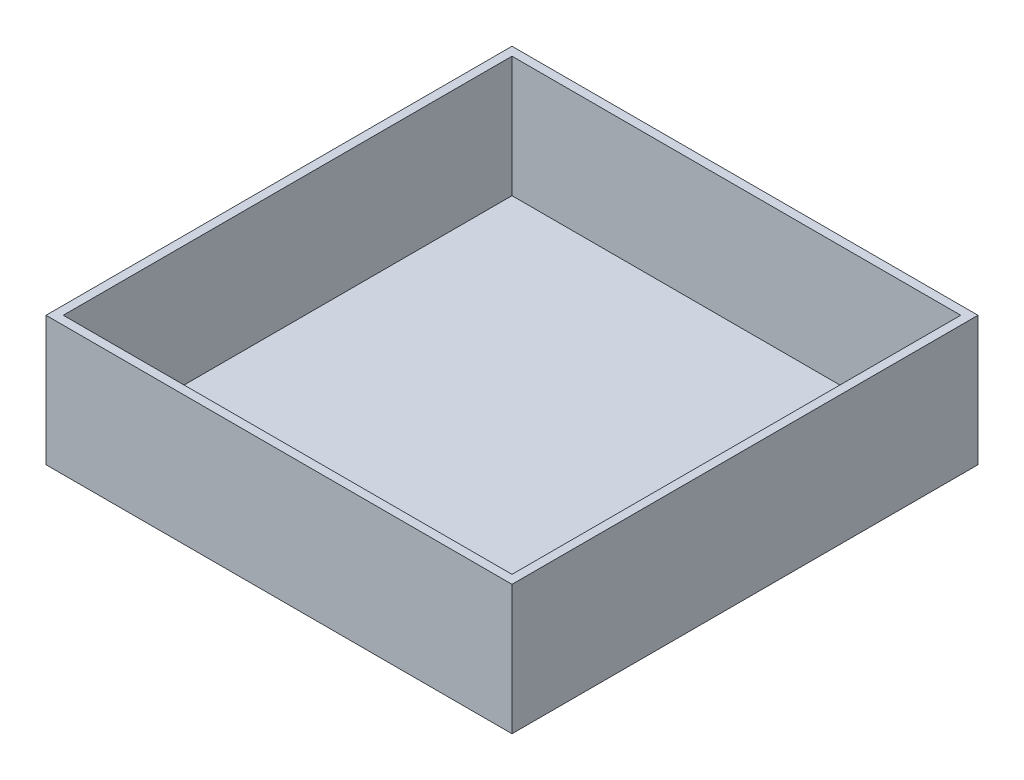
ISO-10303-21;
HEADER;
FILE_DESCRIPTION(('STEP AP214'),'2;1');
FILE_NAME('part.step','',(''),(''),'','','');
FILE_SCHEMA(('AUTOMOTIVE_DESIGN { 1 0 10303 214 1 1 1 1 }'));
ENDSEC;
DATA;
#1=APPLICATION_CONTEXT('core data for automotive mechanical design processes');
#2=APPLICATION_PROTOCOL_DEFINITION('international standard','automotive_design',2000,#1);
#3=PRODUCT_CONTEXT('',#1,'mechanical');
#4=PRODUCT('Part','Part','',(#3));
#5=PRODUCT_RELATED_PRODUCT_CATEGORY('part','',(#4));
#6=PRODUCT_DEFINITION_FORMATION('','',#4);
#7=PRODUCT_DEFINITION_CONTEXT('part definition',#1,'design');
#8=PRODUCT_DEFINITION('design','',#6,#7);
#9=PRODUCT_DEFINITION_SHAPE('','',#8);
#10=(LENGTH_UNIT() NAMED_UNIT(*) SI_UNIT(.MILLI.,.METRE.));
#11=(NAMED_UNIT(*) PLANE_ANGLE_UNIT() SI_UNIT($,.RADIAN.));
#12=(NAMED_UNIT(*) SI_UNIT($,.STERADIAN.) SOLID_ANGLE_UNIT());
#13=UNCERTAINTY_MEASURE_WITH_UNIT(LENGTH_MEASURE(1.E-05),#10,'distance_accuracy_value','');
#14=(GEOMETRIC_REPRESENTATION_CONTEXT(3) GLOBAL_UNCERTAINTY_ASSIGNED_CONTEXT((#13)) GLOBAL_UNIT_ASSIGNED_CONTEXT((#10,
#11,#12)) REPRESENTATION_CONTEXT('',''));
#15=CARTESIAN_POINT('',(0.,0.,0.));
#16=DIRECTION('',(0.,0.,1.));
#17=DIRECTION('',(1.,0.,0.));
#18=AXIS2_PLACEMENT_3D('',#15,#16,#17);
#19=CARTESIAN_POINT('',(152.4,0.,-152.4));
#20=DIRECTION('',(0.,0.,1.));
#21=DIRECTION('',(1.,0.,0.));
#22=AXIS2_PLACEMENT_3D('',#19,#20,#21);
#23=PLANE('',#22);
#24=DIRECTION('',(1.,0.,0.));
#25=VECTOR('',#24,1.);
#26=CARTESIAN_POINT('',(8077.2,0.,-152.4));
#27=LINE('',#26,#25);
#28=CARTESIAN_POINT('',(152.4,0.,-152.4));
#29=VERTEX_POINT('',#28);
#30=CARTESIAN_POINT('',(8077.2,0.,-152.4));
#31=VERTEX_POINT('',#30);
#32=EDGE_CURVE('E46',#29,#31,#27,.T.);
#33=ORIENTED_EDGE('',*,*,#32,.F.);
#34=DIRECTION('',(0.,1.,0.));
#35=VECTOR('',#34,1.);
#36=CARTESIAN_POINT('',(152.4,0.,-152.4));
#37=LINE('',#36,#35);
#38=CARTESIAN_POINT('',(152.4,2133.6,-152.4));
#39=VERTEX_POINT('',#38);
#40=EDGE_CURVE('E138',#29,#39,#37,.T.);
#41=ORIENTED_EDGE('',*,*,#40,.T.);
#42=DIRECTION('',(1.,0.,0.));
#43=VECTOR('',#42,1.);
#44=CARTESIAN_POINT('',(152.4,2133.6,-152.4));
#45=LINE('',#44,#43);
#46=CARTESIAN_POINT('',(8077.2,2133.6,-152.4));
#47=VERTEX_POINT('',#46);
#48=EDGE_CURVE('E129',#39,#47,#45,.T.);
#49=ORIENTED_EDGE('',*,*,#48,.T.);
#50=DIRECTION('',(0.,1.,0.));
#51=VECTOR('',#50,1.);
#52=CARTESIAN_POINT('',(8077.2,0.,-152.4));
#53=LINE('',#52,#51);
#54=EDGE_CURVE('E106',#31,#47,#53,.T.);
#55=ORIENTED_EDGE('',*,*,#54,.F.);
#56=EDGE_LOOP('',(#33,#41,#49,#55));
#57=FACE_BOUND('',#56,.T.);
#58=ADVANCED_FACE('F31',(#57),#23,.F.);
#59=CARTESIAN_POINT('',(152.4,0.,-8077.2));
#60=DIRECTION('',(-1.,0.,0.));
#61=DIRECTION('',(0.,0.,1.));
#62=AXIS2_PLACEMENT_3D('',#59,#60,#61);
#63=PLANE('',#62);
#64=DIRECTION('',(0.,0.,1.));
#65=VECTOR('',#64,1.);
#66=CARTESIAN_POINT('',(152.4,0.,-16003.4652491574));
#67=LINE('',#66,#65);
#68=CARTESIAN_POINT('',(152.4,0.,-8077.2));
#69=VERTEX_POINT('',#68);
#70=EDGE_CURVE('E53',#69,#29,#67,.T.);
#71=ORIENTED_EDGE('',*,*,#70,.F.);
#72=DIRECTION('',(0.,1.,0.));
#73=VECTOR('',#72,1.);
#74=CARTESIAN_POINT('',(152.4,0.,-8077.2));
#75=LINE('',#74,#73);
#76=CARTESIAN_POINT('',(152.4,2133.6,-8077.2));
#77=VERTEX_POINT('',#76);
#78=EDGE_CURVE('E105',#69,#77,#75,.T.);
#79=ORIENTED_EDGE('',*,*,#78,.T.);
#80=DIRECTION('',(0.,0.,1.));
#81=VECTOR('',#80,1.);
#82=CARTESIAN_POINT('',(152.4,2133.6,-8077.2));
#83=LINE('',#82,#81);
#84=EDGE_CURVE('E135',#77,#39,#83,.T.);
#85=ORIENTED_EDGE('',*,*,#84,.T.);
#86=ORIENTED_EDGE('',*,*,#40,.F.);
#87=EDGE_LOOP('',(#71,#79,#85,#86));
#88=FACE_BOUND('',#87,.T.);
#89=ADVANCED_FACE('F187',(#88),#63,.F.);
#90=CARTESIAN_POINT('',(8077.2,0.,-8077.2));
#91=DIRECTION('',(0.,0.,-1.));
#92=DIRECTION('',(-1.,0.,0.));
#93=AXIS2_PLACEMENT_3D('',#90,#91,#92);
#94=PLANE('',#93);
#95=DIRECTION('',(1.,0.,0.));
#96=VECTOR('',#95,1.);
#97=CARTESIAN_POINT('',(8077.2,0.,-8077.2));
#98=LINE('',#97,#96);
#99=CARTESIAN_POINT('',(8077.2,0.,-8077.2));
#100=VERTEX_POINT('',#99);
#101=EDGE_CURVE('E109',#69,#100,#98,.T.);
#102=ORIENTED_EDGE('',*,*,#101,.T.);
#103=DIRECTION('',(0.,1.,0.));
#104=VECTOR('',#103,1.);
#105=CARTESIAN_POINT('',(8077.2,0.,-8077.2));
#106=LINE('',#105,#104);
#107=CARTESIAN_POINT('',(8077.2,2133.6,-8077.2));
#108=VERTEX_POINT('',#107);
#109=EDGE_CURVE('E95',#100,#108,#106,.T.);
#110=ORIENTED_EDGE('',*,*,#109,.T.);
#111=DIRECTION('',(-1.,0.,0.));
#112=VECTOR('',#111,1.);
#113=CARTESIAN_POINT('',(8077.2,2133.6,-8077.2));
#114=LINE('',#113,#112);
#115=EDGE_CURVE('E133',#108,#77,#114,.T.);
#116=ORIENTED_EDGE('',*,*,#115,.T.);
#117=ORIENTED_EDGE('',*,*,#78,.F.);
#118=EDGE_LOOP('',(#102,#110,#116,#117));
#119=FACE_BOUND('',#118,.T.);
#120=ADVANCED_FACE('F110',(#119),#94,.F.);
#121=CARTESIAN_POINT('',(8077.2,0.,-152.4));
#122=DIRECTION('',(1.,0.,0.));
#123=DIRECTION('',(0.,0.,-1.));
#124=AXIS2_PLACEMENT_3D('',#121,#122,#123);
#125=PLANE('',#124);
#126=DIRECTION('',(0.,0.,1.));
#127=VECTOR('',#126,1.);
#128=CARTESIAN_POINT('',(8077.2,0.,-16003.4652491574));
#129=LINE('',#128,#127);
#130=EDGE_CURVE('E99',#100,#31,#129,.T.);
#131=ORIENTED_EDGE('',*,*,#130,.T.);
#132=ORIENTED_EDGE('',*,*,#54,.T.);
#133=DIRECTION('',(0.,0.,-1.));
#134=VECTOR('',#133,1.);
#135=CARTESIAN_POINT('',(8077.2,2133.6,-152.4));
#136=LINE('',#135,#134);
#137=EDGE_CURVE('E101',#47,#108,#136,.T.);
#138=ORIENTED_EDGE('',*,*,#137,.T.);
#139=ORIENTED_EDGE('',*,*,#109,.F.);
#140=EDGE_LOOP('',(#131,#132,#138,#139));
#141=FACE_BOUND('',#140,.T.);
#142=ADVANCED_FACE('F97',(#141),#125,.F.);
#143=CARTESIAN_POINT('',(0.,2133.6,0.));
#144=DIRECTION('',(1.,0.,0.));
#145=DIRECTION('',(0.,0.,-1.));
#146=AXIS2_PLACEMENT_3D('',#143,#144,#145);
#147=PLANE('',#146);
#148=DIRECTION('',(0.,-1.,0.));
#149=VECTOR('',#148,1.);
#150=CARTESIAN_POINT('',(0.,2133.6,-8229.6));
#151=LINE('',#150,#149);
#152=CARTESIAN_POINT('',(0.,2133.6,-8229.6));
#153=VERTEX_POINT('',#152);
#154=CARTESIAN_POINT('',(0.,-152.4,-8229.6));
#155=VERTEX_POINT('',#154);
#156=EDGE_CURVE('E151',#153,#155,#151,.T.);
#157=ORIENTED_EDGE('',*,*,#156,.T.);
#158=DIRECTION('',(0.,0.,-1.));
#159=VECTOR('',#158,1.);
#160=CARTESIAN_POINT('',(0.,-152.4,0.));
#161=LINE('',#160,#159);
#162=CARTESIAN_POINT('',(0.,-152.4,0.));
#163=VERTEX_POINT('',#162);
#164=EDGE_CURVE('E112',#163,#155,#161,.T.);
#165=ORIENTED_EDGE('',*,*,#164,.F.);
#166=DIRECTION('',(0.,-1.,0.));
#167=VECTOR('',#166,1.);
#168=CARTESIAN_POINT('',(0.,2133.6,0.));
#169=LINE('',#168,#167);
#170=CARTESIAN_POINT('',(0.,2133.6,0.));
#171=VERTEX_POINT('',#170);
#172=EDGE_CURVE('E11',#171,#163,#169,.T.);
#173=ORIENTED_EDGE('',*,*,#172,.F.);
#174=DIRECTION('',(0.,0.,1.));
#175=VECTOR('',#174,1.);
#176=CARTESIAN_POINT('',(0.,2133.6,0.));
#177=LINE('',#176,#175);
#178=EDGE_CURVE('E140',#153,#171,#177,.T.);
#179=ORIENTED_EDGE('',*,*,#178,.F.);
#180=EDGE_LOOP('',(#157,#165,#173,#179));
#181=FACE_BOUND('',#180,.T.);
#182=ADVANCED_FACE('F33',(#181),#147,.F.);
#183=CARTESIAN_POINT('',(0.,2133.6,0.));
#184=DIRECTION('',(0.,0.,-1.));
#185=DIRECTION('',(-1.,0.,0.));
#186=AXIS2_PLACEMENT_3D('',#183,#184,#185);
#187=PLANE('',#186);
#188=ORIENTED_EDGE('',*,*,#172,.T.);
#189=DIRECTION('',(-1.,0.,0.));
#190=VECTOR('',#189,1.);
#191=CARTESIAN_POINT('',(0.,-152.4,0.));
#192=LINE('',#191,#190);
#193=CARTESIAN_POINT('',(8229.6,-152.4,0.));
#194=VERTEX_POINT('',#193);
#195=EDGE_CURVE('E126',#194,#163,#192,.T.);
#196=ORIENTED_EDGE('',*,*,#195,.F.);
#197=DIRECTION('',(0.,-1.,0.));
#198=VECTOR('',#197,1.);
#199=CARTESIAN_POINT('',(8229.6,2133.6,0.));
#200=LINE('',#199,#198);
#201=CARTESIAN_POINT('',(8229.6,2133.6,0.));
#202=VERTEX_POINT('',#201);
#203=EDGE_CURVE('E39',#202,#194,#200,.T.);
#204=ORIENTED_EDGE('',*,*,#203,.F.);
#205=DIRECTION('',(1.,0.,0.));
#206=VECTOR('',#205,1.);
#207=CARTESIAN_POINT('',(0.,2133.6,0.));
#208=LINE('',#207,#206);
#209=EDGE_CURVE('E145',#171,#202,#208,.T.);
#210=ORIENTED_EDGE('',*,*,#209,.F.);
#211=EDGE_LOOP('',(#188,#196,#204,#210));
#212=FACE_BOUND('',#211,.T.);
#213=ADVANCED_FACE('F166',(#212),#187,.F.);
#214=CARTESIAN_POINT('',(8229.6,2133.6,0.));
#215=DIRECTION('',(-1.,0.,0.));
#216=DIRECTION('',(0.,0.,1.));
#217=AXIS2_PLACEMENT_3D('',#214,#215,#216);
#218=PLANE('',#217);
#219=ORIENTED_EDGE('',*,*,#203,.T.);
#220=DIRECTION('',(0.,0.,1.));
#221=VECTOR('',#220,1.);
#222=CARTESIAN_POINT('',(8229.6,-152.4,0.));
#223=LINE('',#222,#221);
#224=CARTESIAN_POINT('',(8229.6,-152.4,-8229.6));
#225=VERTEX_POINT('',#224);
#226=EDGE_CURVE('E123',#225,#194,#223,.T.);
#227=ORIENTED_EDGE('',*,*,#226,.F.);
#228=DIRECTION('',(0.,-1.,0.));
#229=VECTOR('',#228,1.);
#230=CARTESIAN_POINT('',(8229.6,2133.6,-8229.6));
#231=LINE('',#230,#229);
#232=CARTESIAN_POINT('',(8229.6,2133.6,-8229.6));
#233=VERTEX_POINT('',#232);
#234=EDGE_CURVE('E153',#233,#225,#231,.T.);
#235=ORIENTED_EDGE('',*,*,#234,.F.);
#236=DIRECTION('',(0.,0.,-1.));
#237=VECTOR('',#236,1.);
#238=CARTESIAN_POINT('',(8229.6,2133.6,0.));
#239=LINE('',#238,#237);
#240=EDGE_CURVE('E147',#202,#233,#239,.T.);
#241=ORIENTED_EDGE('',*,*,#240,.F.);
#242=EDGE_LOOP('',(#219,#227,#235,#241));
#243=FACE_BOUND('',#242,.T.);
#244=ADVANCED_FACE('F158',(#243),#218,.F.);
#245=CARTESIAN_POINT('',(0.,2133.6,-8229.6));
#246=DIRECTION('',(0.,0.,1.));
#247=DIRECTION('',(1.,0.,0.));
#248=AXIS2_PLACEMENT_3D('',#245,#246,#247);
#249=PLANE('',#248);
#250=ORIENTED_EDGE('',*,*,#234,.T.);
#251=DIRECTION('',(1.,0.,0.));
#252=VECTOR('',#251,1.);
#253=CARTESIAN_POINT('',(0.,-152.4,-8229.6));
#254=LINE('',#253,#252);
#255=EDGE_CURVE('E120',#155,#225,#254,.T.);
#256=ORIENTED_EDGE('',*,*,#255,.F.);
#257=ORIENTED_EDGE('',*,*,#156,.F.);
#258=DIRECTION('',(-1.,0.,0.));
#259=VECTOR('',#258,1.);
#260=CARTESIAN_POINT('',(0.,2133.6,-8229.6));
#261=LINE('',#260,#259);
#262=EDGE_CURVE('E149',#233,#153,#261,.T.);
#263=ORIENTED_EDGE('',*,*,#262,.F.);
#264=EDGE_LOOP('',(#250,#256,#257,#263));
#265=FACE_BOUND('',#264,.T.);
#266=ADVANCED_FACE('F173',(#265),#249,.F.);
#267=CARTESIAN_POINT('',(0.,2133.6,-8229.6));
#268=DIRECTION('',(0.,-1.,0.));
#269=DIRECTION('',(0.,0.,-1.));
#270=AXIS2_PLACEMENT_3D('',#267,#268,#269);
#271=PLANE('',#270);
#272=ORIENTED_EDGE('',*,*,#137,.F.);
#273=ORIENTED_EDGE('',*,*,#48,.F.);
#274=ORIENTED_EDGE('',*,*,#84,.F.);
#275=ORIENTED_EDGE('',*,*,#115,.F.);
#276=EDGE_LOOP('',(#272,#273,#274,#275));
#277=FACE_BOUND('',#276,.T.);
#278=ORIENTED_EDGE('',*,*,#178,.T.);
#279=ORIENTED_EDGE('',*,*,#209,.T.);
#280=ORIENTED_EDGE('',*,*,#240,.T.);
#281=ORIENTED_EDGE('',*,*,#262,.T.);
#282=EDGE_LOOP('',(#278,#279,#280,#281));
#283=FACE_BOUND('',#282,.T.);
#284=ADVANCED_FACE('F175',(#277,#283),#271,.F.);
#285=CARTESIAN_POINT('',(0.,-152.4,-8229.6));
#286=DIRECTION('',(0.,-1.,0.));
#287=DIRECTION('',(0.,0.,-1.));
#288=AXIS2_PLACEMENT_3D('',#285,#286,#287);
#289=PLANE('',#288);
#290=ORIENTED_EDGE('',*,*,#164,.T.);
#291=ORIENTED_EDGE('',*,*,#255,.T.);
#292=ORIENTED_EDGE('',*,*,#226,.T.);
#293=ORIENTED_EDGE('',*,*,#195,.T.);
#294=EDGE_LOOP('',(#290,#291,#292,#293));
#295=FACE_BOUND('',#294,.T.);
#296=ADVANCED_FACE('F163',(#295),#289,.T.);
#297=CARTESIAN_POINT('',(8077.2,0.,-16003.4652491574));
#298=DIRECTION('',(0.,-1.,0.));
#299=DIRECTION('',(0.,0.,-1.));
#300=AXIS2_PLACEMENT_3D('',#297,#298,#299);
#301=PLANE('',#300);
#302=ORIENTED_EDGE('',*,*,#101,.F.);
#303=ORIENTED_EDGE('',*,*,#70,.T.);
#304=ORIENTED_EDGE('',*,*,#32,.T.);
#305=ORIENTED_EDGE('',*,*,#130,.F.);
#306=EDGE_LOOP('',(#302,#303,#304,#305));
#307=FACE_BOUND('',#306,.T.);
#308=ADVANCED_FACE('F114',(#307),#301,.F.);
#309=CLOSED_SHELL('',(#58,#89,#120,#142,#182,#213,#244,#266,#284,#296,#308));
#310=MANIFOLD_SOLID_BREP('B2',#309);
#311=ADVANCED_BREP_SHAPE_REPRESENTATION('',(#18,#310),#14);
#312=SHAPE_DEFINITION_REPRESENTATION(#9,#311);
ENDSEC;
END-ISO-10303-21;
